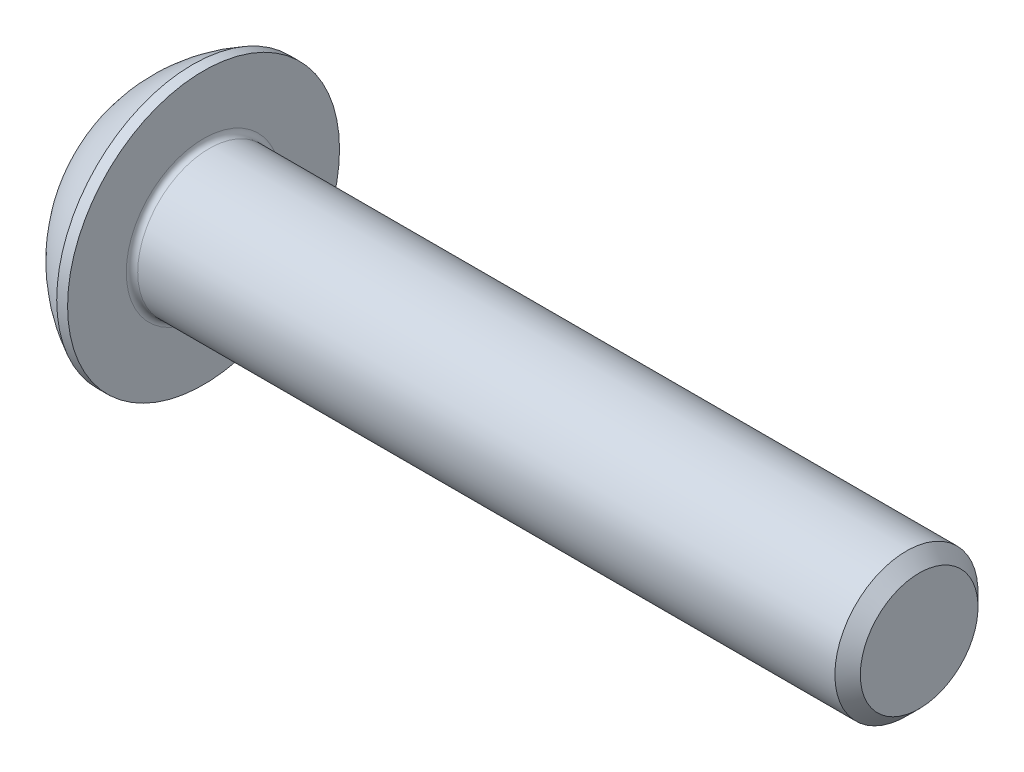
ISO-10303-21;
HEADER;
FILE_DESCRIPTION(('STEP AP214'),'2;1');
FILE_NAME('part.step','',(''),(''),'','','');
FILE_SCHEMA(('AUTOMOTIVE_DESIGN { 1 0 10303 214 1 1 1 1 }'));
ENDSEC;
DATA;
#1=APPLICATION_CONTEXT('core data for automotive mechanical design processes');
#2=APPLICATION_PROTOCOL_DEFINITION('international standard','automotive_design',2000,#1);
#3=PRODUCT_CONTEXT('',#1,'mechanical');
#4=PRODUCT('Part','Part','',(#3));
#5=PRODUCT_RELATED_PRODUCT_CATEGORY('part','',(#4));
#6=PRODUCT_DEFINITION_FORMATION('','',#4);
#7=PRODUCT_DEFINITION_CONTEXT('part definition',#1,'design');
#8=PRODUCT_DEFINITION('design','',#6,#7);
#9=PRODUCT_DEFINITION_SHAPE('','',#8);
#10=(LENGTH_UNIT() NAMED_UNIT(*) SI_UNIT(.MILLI.,.METRE.));
#11=(NAMED_UNIT(*) PLANE_ANGLE_UNIT() SI_UNIT($,.RADIAN.));
#12=(NAMED_UNIT(*) SI_UNIT($,.STERADIAN.) SOLID_ANGLE_UNIT());
#13=UNCERTAINTY_MEASURE_WITH_UNIT(LENGTH_MEASURE(1.E-05),#10,'distance_accuracy_value','');
#14=(GEOMETRIC_REPRESENTATION_CONTEXT(3) GLOBAL_UNCERTAINTY_ASSIGNED_CONTEXT((#13)) GLOBAL_UNIT_ASSIGNED_CONTEXT((#10,
#11,#12)) REPRESENTATION_CONTEXT('',''));
#15=CARTESIAN_POINT('',(0.,0.,0.));
#16=DIRECTION('',(0.,0.,1.));
#17=DIRECTION('',(1.,0.,0.));
#18=AXIS2_PLACEMENT_3D('',#15,#16,#17);
#19=CARTESIAN_POINT('',(0.,0.,0.));
#20=DIRECTION('',(-1.,0.,0.));
#21=DIRECTION('',(0.,0.,1.));
#22=AXIS2_PLACEMENT_3D('',#19,#20,#21);
#23=PLANE('',#22);
#24=CARTESIAN_POINT('',(0.,0.,0.));
#25=DIRECTION('',(-1.,0.,0.));
#26=DIRECTION('',(0.,0.,1.));
#27=AXIS2_PLACEMENT_3D('',#24,#25,#26);
#28=CIRCLE('',#27,2.375);
#29=CARTESIAN_POINT('',(0.,2.375,0.));
#30=VERTEX_POINT('',#29);
#31=EDGE_CURVE('E158',#30,#30,#28,.T.);
#32=ORIENTED_EDGE('',*,*,#31,.T.);
#33=EDGE_LOOP('',(#32));
#34=FACE_BOUND('',#33,.T.);
#35=DIRECTION('',(0.,-1.,0.));
#36=VECTOR('',#35,1.);
#37=CARTESIAN_POINT('',(0.,-0.866025403784437,1.5));
#38=LINE('',#37,#36);
#39=CARTESIAN_POINT('',(0.,0.86602540378444,1.5));
#40=VERTEX_POINT('',#39);
#41=CARTESIAN_POINT('',(0.,-0.866025403784437,1.5));
#42=VERTEX_POINT('',#41);
#43=EDGE_CURVE('E53',#40,#42,#38,.T.);
#44=ORIENTED_EDGE('',*,*,#43,.T.);
#45=DIRECTION('',(0.,-0.5,-0.866025403784438));
#46=VECTOR('',#45,1.);
#47=CARTESIAN_POINT('',(0.,-1.73205080756888,0.));
#48=LINE('',#47,#46);
#49=CARTESIAN_POINT('',(0.,-1.73205080756888,0.));
#50=VERTEX_POINT('',#49);
#51=EDGE_CURVE('E278',#42,#50,#48,.T.);
#52=ORIENTED_EDGE('',*,*,#51,.T.);
#53=DIRECTION('',(0.,0.5,-0.866025403784438));
#54=VECTOR('',#53,1.);
#55=CARTESIAN_POINT('',(0.,-0.866025403784437,-1.5));
#56=LINE('',#55,#54);
#57=CARTESIAN_POINT('',(0.,-0.866025403784437,-1.5));
#58=VERTEX_POINT('',#57);
#59=EDGE_CURVE('E133',#50,#58,#56,.T.);
#60=ORIENTED_EDGE('',*,*,#59,.T.);
#61=DIRECTION('',(0.,1.,0.));
#62=VECTOR('',#61,1.);
#63=CARTESIAN_POINT('',(0.,0.86602540378444,-1.5));
#64=LINE('',#63,#62);
#65=CARTESIAN_POINT('',(0.,0.86602540378444,-1.5));
#66=VERTEX_POINT('',#65);
#67=EDGE_CURVE('E281',#58,#66,#64,.T.);
#68=ORIENTED_EDGE('',*,*,#67,.T.);
#69=DIRECTION('',(0.,0.5,0.866025403784439));
#70=VECTOR('',#69,1.);
#71=CARTESIAN_POINT('',(0.,1.73205080756888,0.));
#72=LINE('',#71,#70);
#73=CARTESIAN_POINT('',(0.,1.73205080756888,0.));
#74=VERTEX_POINT('',#73);
#75=EDGE_CURVE('E283',#66,#74,#72,.T.);
#76=ORIENTED_EDGE('',*,*,#75,.T.);
#77=DIRECTION('',(0.,-0.5,0.866025403784439));
#78=VECTOR('',#77,1.);
#79=CARTESIAN_POINT('',(0.,0.86602540378444,1.5));
#80=LINE('',#79,#78);
#81=EDGE_CURVE('E285',#74,#40,#80,.T.);
#82=ORIENTED_EDGE('',*,*,#81,.T.);
#83=EDGE_LOOP('',(#44,#52,#60,#68,#76,#82));
#84=FACE_BOUND('',#83,.T.);
#85=ADVANCED_FACE('F38',(#34,#84),#23,.T.);
#86=CARTESIAN_POINT('',(4.75501582278481,0.,0.));
#87=DIRECTION('',(-1.,0.,0.));
#88=DIRECTION('',(0.,1.,0.));
#89=AXIS2_PLACEMENT_3D('',#86,#87,#88);
#90=SPHERICAL_SURFACE('',#89,5.3151482081814);
#91=CARTESIAN_POINT('',(2.37,0.,0.));
#92=DIRECTION('',(-1.,0.,0.));
#93=DIRECTION('',(0.,0.,1.));
#94=AXIS2_PLACEMENT_3D('',#91,#92,#93);
#95=CIRCLE('',#94,4.75);
#96=CARTESIAN_POINT('',(2.37,4.75,0.));
#97=VERTEX_POINT('',#96);
#98=EDGE_CURVE('E155',#97,#97,#95,.T.);
#99=CARTESIAN_POINT('',(2.37,4.75,0.));
#100=CARTESIAN_POINT('',(2.33822259048669,4.7340443473251,0.));
#101=CARTESIAN_POINT('',(2.30660534291523,4.71776971995817,0.));
#102=CARTESIAN_POINT('',(2.24370380094997,4.68458927158339,0.));
#103=CARTESIAN_POINT('',(2.21241950655618,4.66768345057554,0.));
#104=CARTESIAN_POINT('',(2.15019650024021,4.6332473706621,0.));
#105=CARTESIAN_POINT('',(2.11925778831804,4.6157171117565,0.));
#106=CARTESIAN_POINT('',(2.05773840110808,4.58003923142985,0.));
#107=CARTESIAN_POINT('',(2.02715772582028,4.56189161000879,0.));
#108=CARTESIAN_POINT('',(1.96636673145741,4.52498631044657,0.));
#109=CARTESIAN_POINT('',(1.93615641238234,4.50622863230542,0.));
#110=CARTESIAN_POINT('',(1.87611829826807,4.46811077571318,0.));
#111=CARTESIAN_POINT('',(1.84629050322887,4.4487505972621,0.));
#112=CARTESIAN_POINT('',(1.78702945162455,4.40943553782984,0.));
#113=CARTESIAN_POINT('',(1.75759619505941,4.38948065684865,0.));
#114=CARTESIAN_POINT('',(1.69913607574061,4.34898423002648,0.));
#115=CARTESIAN_POINT('',(1.67010921298694,4.32844268418549,0.));
#116=CARTESIAN_POINT('',(1.61247357298735,4.28678120152175,0.));
#117=CARTESIAN_POINT('',(1.58386479574143,4.265661264699,0.));
#118=CARTESIAN_POINT('',(1.52707685004032,4.22285150694424,0.));
#119=CARTESIAN_POINT('',(1.49889768158512,4.20116168601223,0.));
#120=CARTESIAN_POINT('',(1.44298030371049,4.15722089644741,0.));
#121=CARTESIAN_POINT('',(1.41524209429107,4.13496992781461,0.));
#122=CARTESIAN_POINT('',(1.36021780711889,4.08991580528235,0.));
#123=CARTESIAN_POINT('',(1.33293172936613,4.06711265138288,0.));
#124=CARTESIAN_POINT('',(1.278822696045,4.02096334316478,0.));
#125=CARTESIAN_POINT('',(1.25199974047662,3.99761718884614,0.));
#126=CARTESIAN_POINT('',(1.19882775550162,3.95039128335163,0.));
#127=CARTESIAN_POINT('',(1.172478726095,3.92651153217576,0.));
#128=CARTESIAN_POINT('',(1.1202652065289,3.87822805145535,0.));
#129=CARTESIAN_POINT('',(1.09440071636942,3.85382432191081,0.));
#130=CARTESIAN_POINT('',(1.04316669321617,3.8045027139941,0.));
#131=CARTESIAN_POINT('',(1.01779716022241,3.77958483562192,0.));
#132=CARTESIAN_POINT('',(0.967563269956099,3.72924496668416,0.));
#133=CARTESIAN_POINT('',(0.942698912683561,3.70382297611859,0.));
#134=CARTESIAN_POINT('',(0.893485388936279,3.65248512247887,0.));
#135=CARTESIAN_POINT('',(0.869136222461535,3.62656925940472,0.));
#136=CARTESIAN_POINT('',(0.820962887873489,3.57425409935884,0.));
#137=CARTESIAN_POINT('',(0.797138719760187,3.54785480238711,0.));
#138=CARTESIAN_POINT('',(0.750024977995377,3.49458340787865,0.));
#139=CARTESIAN_POINT('',(0.726735404343869,3.46771131034191,0.));
#140=CARTESIAN_POINT('',(0.680700232274541,3.41350513847464,0.));
#141=CARTESIAN_POINT('',(0.657954633856721,3.3861710641441,0.));
#142=CARTESIAN_POINT('',(0.613016573919583,3.33105194853939,0.));
#143=CARTESIAN_POINT('',(0.590824112400263,3.30326690726522,0.));
#144=CARTESIAN_POINT('',(0.547001265128254,3.24725704926748,0.));
#145=CARTESIAN_POINT('',(0.525370879375564,3.21903223254391,0.));
#146=CARTESIAN_POINT('',(0.482680896105489,3.16215419227901,0.));
#147=CARTESIAN_POINT('',(0.461621298588104,3.13350096873769,0.));
#148=CARTESIAN_POINT('',(0.420081374357153,3.07577765602272,0.));
#149=CARTESIAN_POINT('',(0.399601047643587,3.04670756684908,0.));
#150=CARTESIAN_POINT('',(0.359227914239947,2.98816223197683,0.));
#151=CARTESIAN_POINT('',(0.339335107549872,2.95868698627821,0.));
#152=CARTESIAN_POINT('',(0.300145026860787,2.89934321060632,0.));
#153=CARTESIAN_POINT('',(0.280847752861776,2.86947468063304,0.));
#154=CARTESIAN_POINT('',(0.24285650999714,2.80935636725696,0.));
#155=CARTESIAN_POINT('',(0.224162541131515,2.77910658385417,0.));
#156=CARTESIAN_POINT('',(0.187385439283607,2.71823794734018,0.));
#157=CARTESIAN_POINT('',(0.169302306301325,2.68761909422898,0.));
#158=CARTESIAN_POINT('',(0.133754156035989,2.626024653246,0.));
#159=CARTESIAN_POINT('',(0.116289138752934,2.59504906537421,0.));
#160=CARTESIAN_POINT('',(0.081984269005742,2.53275362391635,0.));
#161=CARTESIAN_POINT('',(0.0651444165416041,2.50143377033028,0.));
#162=CARTESIAN_POINT('',(0.0320966055444299,2.43846244094735,0.));
#163=CARTESIAN_POINT('',(0.0158886470113937,2.40681096515049,0.));
#164=CARTESIAN_POINT('',(0.,2.375,0.));
#165=B_SPLINE_CURVE_WITH_KNOTS('',3,(#99,#100,#101,#102,#103,#104,#105,#106,#107,#108,#109,#110,
#111,#112,#113,#114,#115,#116,#117,#118,#119,#120,#121,#122,#123,#124,#125,#126,#127,#128,#129,
#130,#131,#132,#133,#134,#135,#136,#137,#138,#139,#140,#141,#142,#143,#144,#145,#146,#147,#148,
#149,#150,#151,#152,#153,#154,#155,#156,#157,#158,#159,#160,#161,#162,#163,#164),.UNSPECIFIED.,
.F.,.F.,(4,2,2,2,2,2,2,2,2,2,2,2,2,2,2,2,2,2,2,2,2,2,2,2,2,2,2,2,2,2,2,2,4),(0.,
0.106672849678272,0.213345699356545,0.320018549034817,0.426691398713089,0.533364248391363,
0.640037098069635,0.746709947747908,0.85338279742618,0.960055647104452,1.06672849678273,
1.173401346461,1.28007419613927,1.38674704581754,1.49341989549581,1.60009274517409,
1.70676559485236,1.81343844453063,1.9201112942089,2.02678414388718,2.13345699356545,
2.24012984324372,2.34680269292199,2.45347554260027,2.56014839227854,2.66682124195681,
2.77349409163508,2.88016694131336,2.98683979099163,3.0935126406699,3.20018549034817,
3.30685834002645,3.41353118970472),.UNSPECIFIED.);
#166=EDGE_CURVE('BSEAM179',#97,#30,#165,.T.);
#167=ORIENTED_EDGE('',*,*,#98,.T.);
#168=ORIENTED_EDGE('',*,*,#31,.F.);
#169=ORIENTED_EDGE('',*,*,#166,.T.);
#170=ORIENTED_EDGE('',*,*,#166,.F.);
#171=EDGE_LOOP('',(#167,#169,#168,#170));
#172=FACE_BOUND('',#171,.T.);
#173=ADVANCED_FACE('F179',(#172),#90,.T.);
#174=CARTESIAN_POINT('',(0.,0.,0.));
#175=DIRECTION('',(-1.,0.,0.));
#176=DIRECTION('',(0.,0.,1.));
#177=AXIS2_PLACEMENT_3D('',#174,#175,#176);
#178=CYLINDRICAL_SURFACE('',#177,4.75);
#179=ORIENTED_EDGE('',*,*,#98,.F.);
#180=EDGE_LOOP('',(#179));
#181=FACE_BOUND('',#180,.T.);
#182=CARTESIAN_POINT('',(2.75,0.,0.));
#183=DIRECTION('',(-1.,0.,0.));
#184=DIRECTION('',(0.,0.,1.));
#185=AXIS2_PLACEMENT_3D('',#182,#183,#184);
#186=CIRCLE('',#185,4.75);
#187=CARTESIAN_POINT('',(2.75,0.,4.75));
#188=VERTEX_POINT('',#187);
#189=EDGE_CURVE('E152',#188,#188,#186,.T.);
#190=ORIENTED_EDGE('',*,*,#189,.T.);
#191=EDGE_LOOP('',(#190));
#192=FACE_BOUND('',#191,.T.);
#193=ADVANCED_FACE('F184',(#181,#192),#178,.T.);
#194=CARTESIAN_POINT('',(2.75,2.5,0.));
#195=DIRECTION('',(-1.,0.,0.));
#196=DIRECTION('',(0.,0.,1.));
#197=AXIS2_PLACEMENT_3D('',#194,#195,#196);
#198=PLANE('',#197);
#199=CARTESIAN_POINT('',(2.75,0.,0.));
#200=DIRECTION('',(-1.,0.,0.));
#201=DIRECTION('',(0.,0.,1.));
#202=AXIS2_PLACEMENT_3D('',#199,#200,#201);
#203=CIRCLE('',#202,2.7);
#204=CARTESIAN_POINT('',(2.75,0.,2.7));
#205=VERTEX_POINT('',#204);
#206=EDGE_CURVE('E46',#205,#205,#203,.T.);
#207=ORIENTED_EDGE('',*,*,#206,.T.);
#208=EDGE_LOOP('',(#207));
#209=FACE_BOUND('',#208,.T.);
#210=ORIENTED_EDGE('',*,*,#189,.F.);
#211=EDGE_LOOP('',(#210));
#212=FACE_BOUND('',#211,.T.);
#213=ADVANCED_FACE('F163',(#209,#212),#198,.F.);
#214=CARTESIAN_POINT('',(0.,0.,0.));
#215=DIRECTION('',(-1.,0.,0.));
#216=DIRECTION('',(0.,0.,1.));
#217=AXIS2_PLACEMENT_3D('',#214,#215,#216);
#218=CYLINDRICAL_SURFACE('',#217,2.5);
#219=CARTESIAN_POINT('',(2.95,0.,0.));
#220=DIRECTION('',(-1.,0.,0.));
#221=DIRECTION('',(0.,0.,1.));
#222=AXIS2_PLACEMENT_3D('',#219,#220,#221);
#223=CIRCLE('',#222,2.5);
#224=CARTESIAN_POINT('',(2.95,0.,2.5));
#225=VERTEX_POINT('',#224);
#226=EDGE_CURVE('E11',#225,#225,#223,.F.);
#227=ORIENTED_EDGE('',*,*,#226,.T.);
#228=EDGE_LOOP('',(#227));
#229=FACE_BOUND('',#228,.T.);
#230=CARTESIAN_POINT('',(27.305,0.,0.));
#231=DIRECTION('',(-1.,0.,0.));
#232=DIRECTION('',(0.,0.,1.));
#233=AXIS2_PLACEMENT_3D('',#230,#231,#232);
#234=CIRCLE('',#233,2.5);
#235=CARTESIAN_POINT('',(27.305,0.,2.5));
#236=VERTEX_POINT('',#235);
#237=EDGE_CURVE('E149',#236,#236,#234,.T.);
#238=ORIENTED_EDGE('',*,*,#237,.T.);
#239=EDGE_LOOP('',(#238));
#240=FACE_BOUND('',#239,.T.);
#241=ADVANCED_FACE('F193',(#229,#240),#218,.T.);
#242=CARTESIAN_POINT('',(27.75,0.,0.));
#243=DIRECTION('',(-1.,0.,0.));
#244=DIRECTION('',(0.,0.,1.));
#245=AXIS2_PLACEMENT_3D('',#242,#243,#244);
#246=CONICAL_SURFACE('',#245,2.055,0.785398163397438);
#247=ORIENTED_EDGE('',*,*,#237,.F.);
#248=EDGE_LOOP('',(#247));
#249=FACE_BOUND('',#248,.T.);
#250=CARTESIAN_POINT('',(27.75,0.,0.));
#251=DIRECTION('',(-1.,0.,0.));
#252=DIRECTION('',(0.,0.,1.));
#253=AXIS2_PLACEMENT_3D('',#250,#251,#252);
#254=CIRCLE('',#253,2.055);
#255=CARTESIAN_POINT('',(27.75,0.,2.055));
#256=VERTEX_POINT('',#255);
#257=EDGE_CURVE('E145',#256,#256,#254,.T.);
#258=ORIENTED_EDGE('',*,*,#257,.T.);
#259=EDGE_LOOP('',(#258));
#260=FACE_BOUND('',#259,.T.);
#261=ADVANCED_FACE('F174',(#249,#260),#246,.T.);
#262=CARTESIAN_POINT('',(27.75,0.,0.));
#263=DIRECTION('',(-1.,0.,0.));
#264=DIRECTION('',(0.,0.,1.));
#265=AXIS2_PLACEMENT_3D('',#262,#263,#264);
#266=PLANE('',#265);
#267=ORIENTED_EDGE('',*,*,#257,.F.);
#268=EDGE_LOOP('',(#267));
#269=FACE_BOUND('',#268,.T.);
#270=ADVANCED_FACE('F167',(#269),#266,.F.);
#271=CARTESIAN_POINT('',(2.95,0.,0.));
#272=DIRECTION('',(-1.,0.,0.));
#273=DIRECTION('',(0.,0.,1.));
#274=AXIS2_PLACEMENT_3D('',#271,#272,#273);
#275=TOROIDAL_SURFACE('',#274,2.7,0.2);
#276=ORIENTED_EDGE('',*,*,#226,.F.);
#277=EDGE_LOOP('',(#276));
#278=FACE_BOUND('',#277,.T.);
#279=ORIENTED_EDGE('',*,*,#206,.F.);
#280=EDGE_LOOP('',(#279));
#281=FACE_BOUND('',#280,.T.);
#282=ADVANCED_FACE('F40',(#278,#281),#275,.F.);
#283=CARTESIAN_POINT('',(1.56,-1.73205080756888,0.));
#284=DIRECTION('',(0.,0.866025403784438,-0.5));
#285=DIRECTION('',(0.,0.5,0.866025403784439));
#286=AXIS2_PLACEMENT_3D('',#283,#284,#285);
#287=PLANE('',#286);
#288=DIRECTION('',(0.,-0.5,-0.866025403784438));
#289=VECTOR('',#288,1.);
#290=CARTESIAN_POINT('',(1.56,-1.73205080756888,0.));
#291=LINE('',#290,#289);
#292=CARTESIAN_POINT('',(1.56,-0.866025403784437,1.5));
#293=VERTEX_POINT('',#292);
#294=CARTESIAN_POINT('',(1.56,-1.29903810567666,0.75));
#295=VERTEX_POINT('',#294);
#296=EDGE_CURVE('E119',#293,#295,#291,.T.);
#297=ORIENTED_EDGE('',*,*,#296,.T.);
#298=CARTESIAN_POINT('',(1.56,-1.73205080756888,0.));
#299=VERTEX_POINT('',#298);
#300=EDGE_CURVE('E114',#295,#299,#291,.T.);
#301=ORIENTED_EDGE('',*,*,#300,.T.);
#302=DIRECTION('',(-1.,0.,0.));
#303=VECTOR('',#302,1.);
#304=CARTESIAN_POINT('',(1.56,-1.73205080756888,0.));
#305=LINE('',#304,#303);
#306=EDGE_CURVE('E116',#299,#50,#305,.T.);
#307=ORIENTED_EDGE('',*,*,#306,.T.);
#308=ORIENTED_EDGE('',*,*,#51,.F.);
#309=DIRECTION('',(-1.,0.,0.));
#310=VECTOR('',#309,1.);
#311=CARTESIAN_POINT('',(1.56,-0.866025403784437,1.5));
#312=LINE('',#311,#310);
#313=EDGE_CURVE('E274',#293,#42,#312,.T.);
#314=ORIENTED_EDGE('',*,*,#313,.F.);
#315=EDGE_LOOP('',(#297,#301,#307,#308,#314));
#316=FACE_BOUND('',#315,.T.);
#317=ADVANCED_FACE('F115',(#316),#287,.T.);
#318=CARTESIAN_POINT('',(1.56,-0.866025403784437,-1.5));
#319=DIRECTION('',(0.,0.866025403784438,0.5));
#320=DIRECTION('',(0.,-0.5,0.866025403784439));
#321=AXIS2_PLACEMENT_3D('',#318,#319,#320);
#322=PLANE('',#321);
#323=DIRECTION('',(0.,0.5,-0.866025403784438));
#324=VECTOR('',#323,1.);
#325=CARTESIAN_POINT('',(1.56,-0.866025403784437,-1.5));
#326=LINE('',#325,#324);
#327=CARTESIAN_POINT('',(1.56,-1.29903810567666,-0.750000000000001));
#328=VERTEX_POINT('',#327);
#329=EDGE_CURVE('E61',#299,#328,#326,.T.);
#330=ORIENTED_EDGE('',*,*,#329,.T.);
#331=CARTESIAN_POINT('',(1.56,-0.866025403784437,-1.5));
#332=VERTEX_POINT('',#331);
#333=EDGE_CURVE('E128',#328,#332,#326,.T.);
#334=ORIENTED_EDGE('',*,*,#333,.T.);
#335=DIRECTION('',(-1.,0.,0.));
#336=VECTOR('',#335,1.);
#337=CARTESIAN_POINT('',(1.56,-0.866025403784437,-1.5));
#338=LINE('',#337,#336);
#339=EDGE_CURVE('E135',#332,#58,#338,.T.);
#340=ORIENTED_EDGE('',*,*,#339,.T.);
#341=ORIENTED_EDGE('',*,*,#59,.F.);
#342=ORIENTED_EDGE('',*,*,#306,.F.);
#343=EDGE_LOOP('',(#330,#334,#340,#341,#342));
#344=FACE_BOUND('',#343,.T.);
#345=ADVANCED_FACE('F131',(#344),#322,.T.);
#346=CARTESIAN_POINT('',(1.56,0.86602540378444,-1.5));
#347=DIRECTION('',(0.,0.,1.));
#348=DIRECTION('',(0.,-1.,0.));
#349=AXIS2_PLACEMENT_3D('',#346,#347,#348);
#350=PLANE('',#349);
#351=DIRECTION('',(0.,1.,0.));
#352=VECTOR('',#351,1.);
#353=CARTESIAN_POINT('',(1.56,0.86602540378444,-1.5));
#354=LINE('',#353,#352);
#355=CARTESIAN_POINT('',(1.56,0.,-1.5));
#356=VERTEX_POINT('',#355);
#357=EDGE_CURVE('E255',#332,#356,#354,.T.);
#358=ORIENTED_EDGE('',*,*,#357,.T.);
#359=CARTESIAN_POINT('',(1.56,0.86602540378444,-1.5));
#360=VERTEX_POINT('',#359);
#361=EDGE_CURVE('E127',#356,#360,#354,.T.);
#362=ORIENTED_EDGE('',*,*,#361,.T.);
#363=DIRECTION('',(-1.,0.,0.));
#364=VECTOR('',#363,1.);
#365=CARTESIAN_POINT('',(1.56,0.86602540378444,-1.5));
#366=LINE('',#365,#364);
#367=EDGE_CURVE('E140',#360,#66,#366,.T.);
#368=ORIENTED_EDGE('',*,*,#367,.T.);
#369=ORIENTED_EDGE('',*,*,#67,.F.);
#370=ORIENTED_EDGE('',*,*,#339,.F.);
#371=EDGE_LOOP('',(#358,#362,#368,#369,#370));
#372=FACE_BOUND('',#371,.T.);
#373=ADVANCED_FACE('F207',(#372),#350,.T.);
#374=CARTESIAN_POINT('',(1.56,1.73205080756888,0.));
#375=DIRECTION('',(0.,-0.866025403784439,0.5));
#376=DIRECTION('',(0.,-0.5,-0.866025403784439));
#377=AXIS2_PLACEMENT_3D('',#374,#375,#376);
#378=PLANE('',#377);
#379=DIRECTION('',(0.,0.5,0.866025403784439));
#380=VECTOR('',#379,1.);
#381=CARTESIAN_POINT('',(1.56,1.73205080756888,0.));
#382=LINE('',#381,#380);
#383=CARTESIAN_POINT('',(1.56,1.29903810567666,-0.75));
#384=VERTEX_POINT('',#383);
#385=EDGE_CURVE('E244',#360,#384,#382,.T.);
#386=ORIENTED_EDGE('',*,*,#385,.T.);
#387=CARTESIAN_POINT('',(1.56,1.73205080756888,0.));
#388=VERTEX_POINT('',#387);
#389=EDGE_CURVE('E249',#384,#388,#382,.T.);
#390=ORIENTED_EDGE('',*,*,#389,.T.);
#391=DIRECTION('',(-1.,0.,0.));
#392=VECTOR('',#391,1.);
#393=CARTESIAN_POINT('',(1.56,1.73205080756888,0.));
#394=LINE('',#393,#392);
#395=EDGE_CURVE('E289',#388,#74,#394,.T.);
#396=ORIENTED_EDGE('',*,*,#395,.T.);
#397=ORIENTED_EDGE('',*,*,#75,.F.);
#398=ORIENTED_EDGE('',*,*,#367,.F.);
#399=EDGE_LOOP('',(#386,#390,#396,#397,#398));
#400=FACE_BOUND('',#399,.T.);
#401=ADVANCED_FACE('F210',(#400),#378,.T.);
#402=CARTESIAN_POINT('',(1.56,0.86602540378444,1.5));
#403=DIRECTION('',(0.,-0.866025403784439,-0.5));
#404=DIRECTION('',(0.,0.5,-0.866025403784439));
#405=AXIS2_PLACEMENT_3D('',#402,#403,#404);
#406=PLANE('',#405);
#407=DIRECTION('',(0.,-0.5,0.866025403784439));
#408=VECTOR('',#407,1.);
#409=CARTESIAN_POINT('',(1.56,0.86602540378444,1.5));
#410=LINE('',#409,#408);
#411=CARTESIAN_POINT('',(1.56,1.29903810567666,0.75));
#412=VERTEX_POINT('',#411);
#413=EDGE_CURVE('E252',#388,#412,#410,.T.);
#414=ORIENTED_EDGE('',*,*,#413,.T.);
#415=CARTESIAN_POINT('',(1.56,0.86602540378444,1.5));
#416=VERTEX_POINT('',#415);
#417=EDGE_CURVE('E260',#412,#416,#410,.T.);
#418=ORIENTED_EDGE('',*,*,#417,.T.);
#419=DIRECTION('',(-1.,0.,0.));
#420=VECTOR('',#419,1.);
#421=CARTESIAN_POINT('',(1.56,0.86602540378444,1.5));
#422=LINE('',#421,#420);
#423=EDGE_CURVE('E273',#416,#40,#422,.T.);
#424=ORIENTED_EDGE('',*,*,#423,.T.);
#425=ORIENTED_EDGE('',*,*,#81,.F.);
#426=ORIENTED_EDGE('',*,*,#395,.F.);
#427=EDGE_LOOP('',(#414,#418,#424,#425,#426));
#428=FACE_BOUND('',#427,.T.);
#429=ADVANCED_FACE('F214',(#428),#406,.T.);
#430=CARTESIAN_POINT('',(1.56,-0.866025403784437,1.5));
#431=DIRECTION('',(0.,0.,-1.));
#432=DIRECTION('',(0.,1.,0.));
#433=AXIS2_PLACEMENT_3D('',#430,#431,#432);
#434=PLANE('',#433);
#435=DIRECTION('',(0.,-1.,0.));
#436=VECTOR('',#435,1.);
#437=CARTESIAN_POINT('',(1.56,-0.866025403784437,1.5));
#438=LINE('',#437,#436);
#439=CARTESIAN_POINT('',(1.56,0.,1.5));
#440=VERTEX_POINT('',#439);
#441=EDGE_CURVE('E266',#416,#440,#438,.T.);
#442=ORIENTED_EDGE('',*,*,#441,.T.);
#443=EDGE_CURVE('E268',#440,#293,#438,.T.);
#444=ORIENTED_EDGE('',*,*,#443,.T.);
#445=ORIENTED_EDGE('',*,*,#313,.T.);
#446=ORIENTED_EDGE('',*,*,#43,.F.);
#447=ORIENTED_EDGE('',*,*,#423,.F.);
#448=EDGE_LOOP('',(#442,#444,#445,#446,#447));
#449=FACE_BOUND('',#448,.T.);
#450=ADVANCED_FACE('F218',(#449),#434,.T.);
#451=CARTESIAN_POINT('',(1.56,-1.73205080756888,0.));
#452=DIRECTION('',(1.,0.,0.));
#453=DIRECTION('',(0.,0.,-1.));
#454=AXIS2_PLACEMENT_3D('',#451,#452,#453);
#455=PLANE('',#454);
#456=CARTESIAN_POINT('',(1.56,0.,0.));
#457=DIRECTION('',(-1.,0.,0.));
#458=DIRECTION('',(0.,0.,1.));
#459=AXIS2_PLACEMENT_3D('',#456,#457,#458);
#460=CIRCLE('',#459,1.5);
#461=EDGE_CURVE('E241',#384,#356,#460,.T.);
#462=ORIENTED_EDGE('',*,*,#461,.F.);
#463=ORIENTED_EDGE('',*,*,#385,.F.);
#464=ORIENTED_EDGE('',*,*,#361,.F.);
#465=EDGE_LOOP('',(#462,#463,#464));
#466=FACE_BOUND('',#465,.T.);
#467=ADVANCED_FACE('F222',(#466),#455,.F.);
#468=EDGE_CURVE('E146',#412,#384,#460,.T.);
#469=ORIENTED_EDGE('',*,*,#468,.F.);
#470=ORIENTED_EDGE('',*,*,#413,.F.);
#471=ORIENTED_EDGE('',*,*,#389,.F.);
#472=EDGE_LOOP('',(#469,#470,#471));
#473=FACE_BOUND('',#472,.T.);
#474=ADVANCED_FACE('F231',(#473),#455,.F.);
#475=EDGE_CURVE('E139',#440,#412,#460,.T.);
#476=ORIENTED_EDGE('',*,*,#475,.F.);
#477=ORIENTED_EDGE('',*,*,#441,.F.);
#478=ORIENTED_EDGE('',*,*,#417,.F.);
#479=EDGE_LOOP('',(#476,#477,#478));
#480=FACE_BOUND('',#479,.T.);
#481=ADVANCED_FACE('F236',(#480),#455,.F.);
#482=EDGE_CURVE('E134',#295,#440,#460,.T.);
#483=ORIENTED_EDGE('',*,*,#482,.F.);
#484=ORIENTED_EDGE('',*,*,#296,.F.);
#485=ORIENTED_EDGE('',*,*,#443,.F.);
#486=EDGE_LOOP('',(#483,#484,#485));
#487=FACE_BOUND('',#486,.T.);
#488=ADVANCED_FACE('F229',(#487),#455,.F.);
#489=EDGE_CURVE('E125',#328,#295,#460,.T.);
#490=ORIENTED_EDGE('',*,*,#489,.F.);
#491=ORIENTED_EDGE('',*,*,#329,.F.);
#492=ORIENTED_EDGE('',*,*,#300,.F.);
#493=EDGE_LOOP('',(#490,#491,#492));
#494=FACE_BOUND('',#493,.T.);
#495=ADVANCED_FACE('F124',(#494),#455,.F.);
#496=EDGE_CURVE('E247',#356,#328,#460,.T.);
#497=ORIENTED_EDGE('',*,*,#496,.F.);
#498=ORIENTED_EDGE('',*,*,#357,.F.);
#499=ORIENTED_EDGE('',*,*,#333,.F.);
#500=EDGE_LOOP('',(#497,#498,#499));
#501=FACE_BOUND('',#500,.T.);
#502=ADVANCED_FACE('F202',(#501),#455,.F.);
#503=CARTESIAN_POINT('',(2.42602540378445,0.,0.));
#504=DIRECTION('',(-1.,0.,0.));
#505=DIRECTION('',(0.,0.,1.));
#506=AXIS2_PLACEMENT_3D('',#503,#504,#505);
#507=CONICAL_SURFACE('',#506,0.,1.04719755119659);
#508=ORIENTED_EDGE('',*,*,#475,.T.);
#509=ORIENTED_EDGE('',*,*,#468,.T.);
#510=ORIENTED_EDGE('',*,*,#461,.T.);
#511=ORIENTED_EDGE('',*,*,#496,.T.);
#512=ORIENTED_EDGE('',*,*,#489,.T.);
#513=ORIENTED_EDGE('',*,*,#482,.T.);
#514=EDGE_LOOP('',(#508,#509,#510,#511,#512,#513));
#515=FACE_BOUND('',#514,.T.);
#516=CARTESIAN_POINT('',(2.42602540378445,0.,0.));
#517=VERTEX_POINT('',#516);
#518=VERTEX_LOOP('',#517);
#519=FACE_BOUND('',#518,.T.);
#520=ADVANCED_FACE('F200',(#515,#519),#507,.F.);
#521=CLOSED_SHELL('',(#85,#173,#193,#213,#241,#261,#270,#282,#317,#345,#373,#401,#429,#450,#467,
#474,#481,#488,#495,#502,#520));
#522=MANIFOLD_SOLID_BREP('B2',#521);
#523=ADVANCED_BREP_SHAPE_REPRESENTATION('',(#18,#522),#14);
#524=SHAPE_DEFINITION_REPRESENTATION(#9,#523);
ENDSEC;
END-ISO-10303-21;
